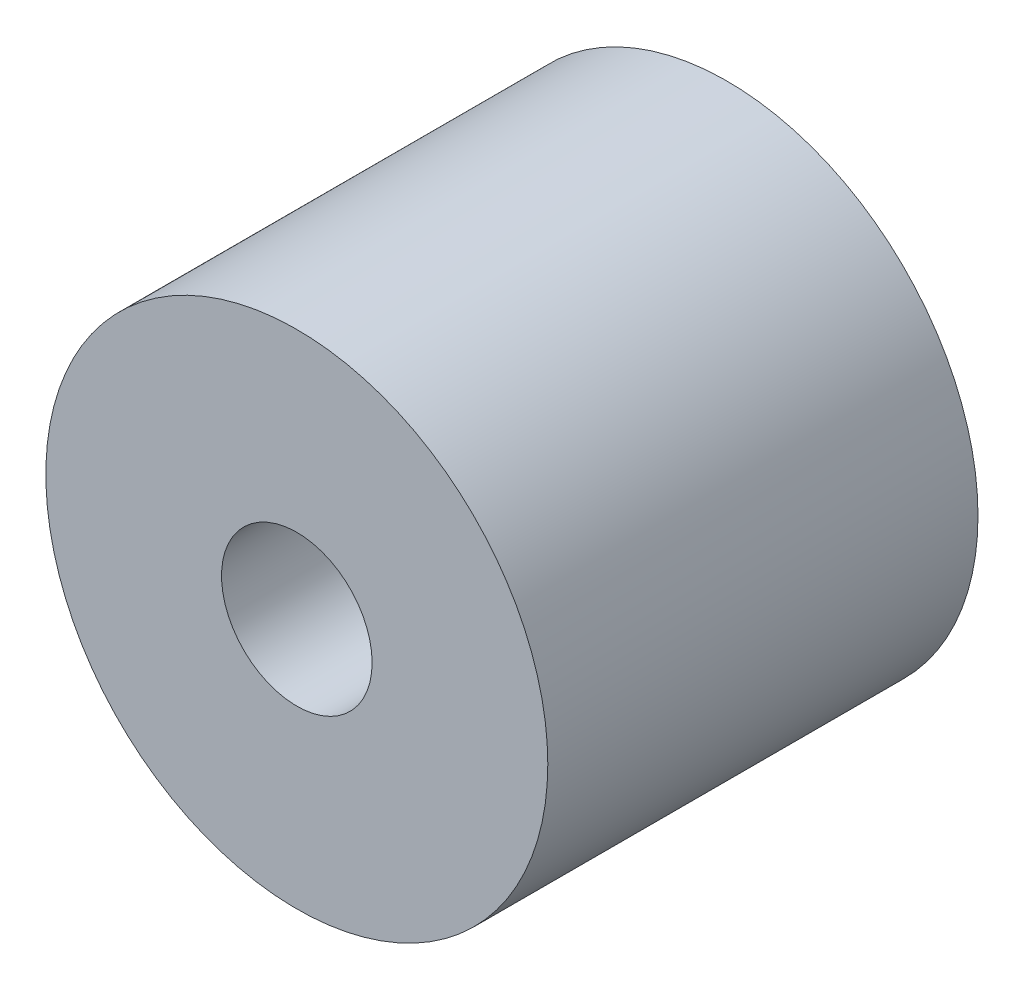
ISO-10303-21;
HEADER;
FILE_DESCRIPTION(('STEP AP214'),'2;1');
FILE_NAME('part.step','',(''),(''),'','','');
FILE_SCHEMA(('AUTOMOTIVE_DESIGN { 1 0 10303 214 1 1 1 1 }'));
ENDSEC;
DATA;
#1=APPLICATION_CONTEXT('core data for automotive mechanical design processes');
#2=APPLICATION_PROTOCOL_DEFINITION('international standard','automotive_design',2000,#1);
#3=PRODUCT_CONTEXT('',#1,'mechanical');
#4=PRODUCT('Part','Part','',(#3));
#5=PRODUCT_RELATED_PRODUCT_CATEGORY('part','',(#4));
#6=PRODUCT_DEFINITION_FORMATION('','',#4);
#7=PRODUCT_DEFINITION_CONTEXT('part definition',#1,'design');
#8=PRODUCT_DEFINITION('design','',#6,#7);
#9=PRODUCT_DEFINITION_SHAPE('','',#8);
#10=(LENGTH_UNIT() NAMED_UNIT(*) SI_UNIT(.MILLI.,.METRE.));
#11=(NAMED_UNIT(*) PLANE_ANGLE_UNIT() SI_UNIT($,.RADIAN.));
#12=(NAMED_UNIT(*) SI_UNIT($,.STERADIAN.) SOLID_ANGLE_UNIT());
#13=UNCERTAINTY_MEASURE_WITH_UNIT(LENGTH_MEASURE(1.E-05),#10,'distance_accuracy_value','');
#14=(GEOMETRIC_REPRESENTATION_CONTEXT(3) GLOBAL_UNCERTAINTY_ASSIGNED_CONTEXT((#13)) GLOBAL_UNIT_ASSIGNED_CONTEXT((#10,
#11,#12)) REPRESENTATION_CONTEXT('',''));
#15=CARTESIAN_POINT('',(0.,0.,0.));
#16=DIRECTION('',(0.,0.,1.));
#17=DIRECTION('',(1.,0.,0.));
#18=AXIS2_PLACEMENT_3D('',#15,#16,#17);
#19=CARTESIAN_POINT('',(0.,0.,12.855));
#20=DIRECTION('',(0.,0.,1.));
#21=DIRECTION('',(1.,0.,0.));
#22=AXIS2_PLACEMENT_3D('',#19,#20,#21);
#23=PLANE('',#22);
#24=CARTESIAN_POINT('',(0.,0.,12.855));
#25=DIRECTION('',(0.,0.,1.));
#26=DIRECTION('',(1.,0.,0.));
#27=AXIS2_PLACEMENT_3D('',#24,#25,#26);
#28=CIRCLE('',#27,7.5);
#29=CARTESIAN_POINT('',(7.5,0.,12.855));
#30=VERTEX_POINT('',#29);
#31=EDGE_CURVE('E10',#30,#30,#28,.T.);
#32=ORIENTED_EDGE('',*,*,#31,.T.);
#33=EDGE_LOOP('',(#32));
#34=FACE_BOUND('',#33,.T.);
#35=CARTESIAN_POINT('',(0.,0.,12.855));
#36=DIRECTION('',(0.,0.,1.));
#37=DIRECTION('',(1.,0.,0.));
#38=AXIS2_PLACEMENT_3D('',#35,#36,#37);
#39=CIRCLE('',#38,2.25);
#40=CARTESIAN_POINT('',(2.25,0.,12.855));
#41=VERTEX_POINT('',#40);
#42=EDGE_CURVE('E44',#41,#41,#39,.T.);
#43=ORIENTED_EDGE('',*,*,#42,.F.);
#44=EDGE_LOOP('',(#43));
#45=FACE_BOUND('',#44,.T.);
#46=ADVANCED_FACE('F33',(#34,#45),#23,.T.);
#47=CARTESIAN_POINT('',(0.,0.,0.));
#48=DIRECTION('',(0.,0.,1.));
#49=DIRECTION('',(1.,0.,0.));
#50=AXIS2_PLACEMENT_3D('',#47,#48,#49);
#51=PLANE('',#50);
#52=CARTESIAN_POINT('',(0.,0.,0.));
#53=DIRECTION('',(0.,0.,1.));
#54=DIRECTION('',(1.,0.,0.));
#55=AXIS2_PLACEMENT_3D('',#52,#53,#54);
#56=CIRCLE('',#55,7.5);
#57=CARTESIAN_POINT('',(7.5,0.,0.));
#58=VERTEX_POINT('',#57);
#59=EDGE_CURVE('E37',#58,#58,#56,.T.);
#60=ORIENTED_EDGE('',*,*,#59,.F.);
#61=EDGE_LOOP('',(#60));
#62=FACE_BOUND('',#61,.T.);
#63=CARTESIAN_POINT('',(0.,0.,0.));
#64=DIRECTION('',(0.,0.,1.));
#65=DIRECTION('',(1.,0.,0.));
#66=AXIS2_PLACEMENT_3D('',#63,#64,#65);
#67=CIRCLE('',#66,2.25);
#68=CARTESIAN_POINT('',(2.25,0.,0.));
#69=VERTEX_POINT('',#68);
#70=EDGE_CURVE('E46',#69,#69,#67,.T.);
#71=ORIENTED_EDGE('',*,*,#70,.T.);
#72=EDGE_LOOP('',(#71));
#73=FACE_BOUND('',#72,.T.);
#74=ADVANCED_FACE('F56',(#62,#73),#51,.F.);
#75=CARTESIAN_POINT('',(0.,0.,12.855));
#76=DIRECTION('',(0.,0.,-1.));
#77=DIRECTION('',(-1.,0.,0.));
#78=AXIS2_PLACEMENT_3D('',#75,#76,#77);
#79=CYLINDRICAL_SURFACE('',#78,7.5);
#80=ORIENTED_EDGE('',*,*,#31,.F.);
#81=EDGE_LOOP('',(#80));
#82=FACE_BOUND('',#81,.T.);
#83=ORIENTED_EDGE('',*,*,#59,.T.);
#84=EDGE_LOOP('',(#83));
#85=FACE_BOUND('',#84,.T.);
#86=ADVANCED_FACE('F35',(#82,#85),#79,.T.);
#87=CARTESIAN_POINT('',(0.,0.,12.855));
#88=DIRECTION('',(0.,0.,-1.));
#89=DIRECTION('',(-1.,0.,0.));
#90=AXIS2_PLACEMENT_3D('',#87,#88,#89);
#91=CYLINDRICAL_SURFACE('',#90,2.25);
#92=ORIENTED_EDGE('',*,*,#42,.T.);
#93=EDGE_LOOP('',(#92));
#94=FACE_BOUND('',#93,.T.);
#95=ORIENTED_EDGE('',*,*,#70,.F.);
#96=EDGE_LOOP('',(#95));
#97=FACE_BOUND('',#96,.T.);
#98=ADVANCED_FACE('F52',(#94,#97),#91,.F.);
#99=CLOSED_SHELL('',(#46,#74,#86,#98));
#100=MANIFOLD_SOLID_BREP('B2',#99);
#101=ADVANCED_BREP_SHAPE_REPRESENTATION('',(#18,#100),#14);
#102=SHAPE_DEFINITION_REPRESENTATION(#9,#101);
ENDSEC;
END-ISO-10303-21;
